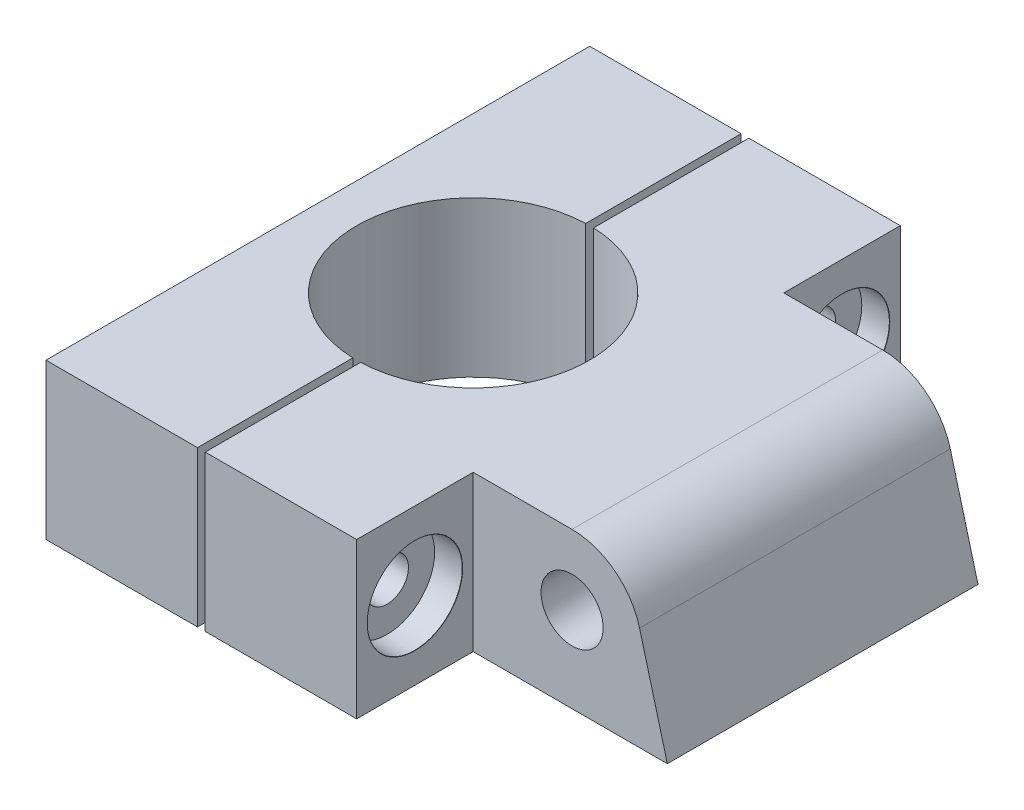
ISO-10303-21;
HEADER;
FILE_DESCRIPTION(('STEP AP214'),'2;1');
FILE_NAME('part.step','',(''),(''),'','','');
FILE_SCHEMA(('AUTOMOTIVE_DESIGN { 1 0 10303 214 1 1 1 1 }'));
ENDSEC;
DATA;
#1=APPLICATION_CONTEXT('core data for automotive mechanical design processes');
#2=APPLICATION_PROTOCOL_DEFINITION('international standard','automotive_design',2000,#1);
#3=PRODUCT_CONTEXT('',#1,'mechanical');
#4=PRODUCT('Part','Part','',(#3));
#5=PRODUCT_RELATED_PRODUCT_CATEGORY('part','',(#4));
#6=PRODUCT_DEFINITION_FORMATION('','',#4);
#7=PRODUCT_DEFINITION_CONTEXT('part definition',#1,'design');
#8=PRODUCT_DEFINITION('design','',#6,#7);
#9=PRODUCT_DEFINITION_SHAPE('','',#8);
#10=(LENGTH_UNIT() NAMED_UNIT(*) SI_UNIT(.MILLI.,.METRE.));
#11=(NAMED_UNIT(*) PLANE_ANGLE_UNIT() SI_UNIT($,.RADIAN.));
#12=(NAMED_UNIT(*) SI_UNIT($,.STERADIAN.) SOLID_ANGLE_UNIT());
#13=UNCERTAINTY_MEASURE_WITH_UNIT(LENGTH_MEASURE(1.E-05),#10,'distance_accuracy_value','');
#14=(GEOMETRIC_REPRESENTATION_CONTEXT(3) GLOBAL_UNCERTAINTY_ASSIGNED_CONTEXT((#13)) GLOBAL_UNIT_ASSIGNED_CONTEXT((#10,
#11,#12)) REPRESENTATION_CONTEXT('',''));
#15=CARTESIAN_POINT('',(0.,0.,0.));
#16=DIRECTION('',(0.,0.,1.));
#17=DIRECTION('',(1.,0.,0.));
#18=AXIS2_PLACEMENT_3D('',#15,#16,#17);
#19=CARTESIAN_POINT('',(0.,-10.,35.));
#20=DIRECTION('',(0.,1.,0.));
#21=DIRECTION('',(0.,0.,1.));
#22=AXIS2_PLACEMENT_3D('',#19,#20,#21);
#23=PLANE('',#22);
#24=DIRECTION('',(0.,0.,1.));
#25=VECTOR('',#24,1.);
#26=CARTESIAN_POINT('',(0.499999999999997,-10.,-35.));
#27=LINE('',#26,#25);
#28=CARTESIAN_POINT('',(0.499999999999997,-10.,-35.));
#29=VERTEX_POINT('',#28);
#30=CARTESIAN_POINT('',(0.5,-10.,-14.9916643505649));
#31=VERTEX_POINT('',#30);
#32=EDGE_CURVE('E278',#29,#31,#27,.T.);
#33=ORIENTED_EDGE('',*,*,#32,.F.);
#34=DIRECTION('',(1.,0.,0.));
#35=VECTOR('',#34,1.);
#36=CARTESIAN_POINT('',(0.,-10.,-35.));
#37=LINE('',#36,#35);
#38=CARTESIAN_POINT('',(20.,-10.,-35.));
#39=VERTEX_POINT('',#38);
#40=EDGE_CURVE('E241',#29,#39,#37,.T.);
#41=ORIENTED_EDGE('',*,*,#40,.T.);
#42=DIRECTION('',(0.,0.,-1.));
#43=VECTOR('',#42,1.);
#44=CARTESIAN_POINT('',(20.,-10.,35.));
#45=LINE('',#44,#43);
#46=CARTESIAN_POINT('',(20.,-10.,-20.));
#47=VERTEX_POINT('',#46);
#48=EDGE_CURVE('E239',#47,#39,#45,.T.);
#49=ORIENTED_EDGE('',*,*,#48,.F.);
#50=DIRECTION('',(1.,0.,0.));
#51=VECTOR('',#50,1.);
#52=CARTESIAN_POINT('',(0.,-10.,-20.));
#53=LINE('',#52,#51);
#54=CARTESIAN_POINT('',(45.,-10.,-20.));
#55=VERTEX_POINT('',#54);
#56=EDGE_CURVE('E200',#47,#55,#53,.T.);
#57=ORIENTED_EDGE('',*,*,#56,.T.);
#58=DIRECTION('',(0.,0.,-1.));
#59=VECTOR('',#58,1.);
#60=CARTESIAN_POINT('',(45.,-10.,20.));
#61=LINE('',#60,#59);
#62=CARTESIAN_POINT('',(45.,-10.,20.));
#63=VERTEX_POINT('',#62);
#64=EDGE_CURVE('E302',#63,#55,#61,.T.);
#65=ORIENTED_EDGE('',*,*,#64,.F.);
#66=DIRECTION('',(1.,0.,0.));
#67=VECTOR('',#66,1.);
#68=CARTESIAN_POINT('',(0.,-10.,20.));
#69=LINE('',#68,#67);
#70=CARTESIAN_POINT('',(20.,-10.,20.));
#71=VERTEX_POINT('',#70);
#72=EDGE_CURVE('E313',#71,#63,#69,.T.);
#73=ORIENTED_EDGE('',*,*,#72,.F.);
#74=CARTESIAN_POINT('',(20.,-10.,35.));
#75=VERTEX_POINT('',#74);
#76=EDGE_CURVE('E260',#75,#71,#45,.T.);
#77=ORIENTED_EDGE('',*,*,#76,.F.);
#78=DIRECTION('',(1.,0.,0.));
#79=VECTOR('',#78,1.);
#80=CARTESIAN_POINT('',(0.,-10.,35.));
#81=LINE('',#80,#79);
#82=CARTESIAN_POINT('',(0.500000000000006,-10.,35.));
#83=VERTEX_POINT('',#82);
#84=EDGE_CURVE('E211',#83,#75,#81,.T.);
#85=ORIENTED_EDGE('',*,*,#84,.F.);
#86=CARTESIAN_POINT('',(0.500000000000003,-10.,14.9916643505649));
#87=VERTEX_POINT('',#86);
#88=EDGE_CURVE('E99',#87,#83,#27,.T.);
#89=ORIENTED_EDGE('',*,*,#88,.F.);
#90=CARTESIAN_POINT('',(0.,-10.,0.));
#91=DIRECTION('',(0.,1.,0.));
#92=DIRECTION('',(0.,0.,1.));
#93=AXIS2_PLACEMENT_3D('',#90,#91,#92);
#94=CIRCLE('',#93,15.);
#95=EDGE_CURVE('E234',#87,#31,#94,.T.);
#96=ORIENTED_EDGE('',*,*,#95,.T.);
#97=EDGE_LOOP('',(#33,#41,#49,#57,#65,#73,#77,#85,#89,#96));
#98=FACE_BOUND('',#97,.T.);
#99=ADVANCED_FACE('F89',(#98),#23,.F.);
#100=CARTESIAN_POINT('',(0.,10.,35.));
#101=DIRECTION('',(0.,1.,0.));
#102=DIRECTION('',(0.,0.,1.));
#103=AXIS2_PLACEMENT_3D('',#100,#101,#102);
#104=PLANE('',#103);
#105=DIRECTION('',(1.,0.,0.));
#106=VECTOR('',#105,1.);
#107=CARTESIAN_POINT('',(0.,10.,-35.));
#108=LINE('',#107,#106);
#109=CARTESIAN_POINT('',(0.499999999999997,10.,-35.));
#110=VERTEX_POINT('',#109);
#111=CARTESIAN_POINT('',(20.,10.,-35.));
#112=VERTEX_POINT('',#111);
#113=EDGE_CURVE('E172',#110,#112,#108,.T.);
#114=ORIENTED_EDGE('',*,*,#113,.F.);
#115=DIRECTION('',(0.,0.,1.));
#116=VECTOR('',#115,1.);
#117=CARTESIAN_POINT('',(0.499999999999997,10.,-35.));
#118=LINE('',#117,#116);
#119=CARTESIAN_POINT('',(0.5,10.,-14.9916643505649));
#120=VERTEX_POINT('',#119);
#121=EDGE_CURVE('E231',#110,#120,#118,.T.);
#122=ORIENTED_EDGE('',*,*,#121,.T.);
#123=CARTESIAN_POINT('',(0.,10.,0.));
#124=DIRECTION('',(0.,1.,0.));
#125=DIRECTION('',(0.,0.,1.));
#126=AXIS2_PLACEMENT_3D('',#123,#124,#125);
#127=CIRCLE('',#126,15.);
#128=CARTESIAN_POINT('',(0.500000000000003,10.,14.9916643505649));
#129=VERTEX_POINT('',#128);
#130=EDGE_CURVE('E205',#129,#120,#127,.T.);
#131=ORIENTED_EDGE('',*,*,#130,.F.);
#132=CARTESIAN_POINT('',(0.500000000000006,10.,35.));
#133=VERTEX_POINT('',#132);
#134=EDGE_CURVE('E226',#129,#133,#118,.T.);
#135=ORIENTED_EDGE('',*,*,#134,.T.);
#136=DIRECTION('',(1.,0.,0.));
#137=VECTOR('',#136,1.);
#138=CARTESIAN_POINT('',(0.,10.,35.));
#139=LINE('',#138,#137);
#140=CARTESIAN_POINT('',(20.,10.,35.));
#141=VERTEX_POINT('',#140);
#142=EDGE_CURVE('E221',#133,#141,#139,.T.);
#143=ORIENTED_EDGE('',*,*,#142,.T.);
#144=DIRECTION('',(0.,0.,-1.));
#145=VECTOR('',#144,1.);
#146=CARTESIAN_POINT('',(20.,10.,35.));
#147=LINE('',#146,#145);
#148=CARTESIAN_POINT('',(20.,10.,20.));
#149=VERTEX_POINT('',#148);
#150=EDGE_CURVE('E213',#141,#149,#147,.T.);
#151=ORIENTED_EDGE('',*,*,#150,.T.);
#152=DIRECTION('',(-1.,0.,0.));
#153=VECTOR('',#152,1.);
#154=CARTESIAN_POINT('',(0.,10.,20.));
#155=LINE('',#154,#153);
#156=CARTESIAN_POINT('',(32.7350732595668,10.,20.));
#157=VERTEX_POINT('',#156);
#158=EDGE_CURVE('E315',#157,#149,#155,.T.);
#159=ORIENTED_EDGE('',*,*,#158,.F.);
#160=DIRECTION('',(0.,0.,-1.));
#161=VECTOR('',#160,1.);
#162=CARTESIAN_POINT('',(32.7350732595668,10.,20.));
#163=LINE('',#162,#161);
#164=CARTESIAN_POINT('',(32.7350732595668,10.,-20.));
#165=VERTEX_POINT('',#164);
#166=EDGE_CURVE('E194',#157,#165,#163,.T.);
#167=ORIENTED_EDGE('',*,*,#166,.T.);
#168=DIRECTION('',(-1.,0.,0.));
#169=VECTOR('',#168,1.);
#170=CARTESIAN_POINT('',(0.,10.,-20.));
#171=LINE('',#170,#169);
#172=CARTESIAN_POINT('',(20.,10.,-20.));
#173=VERTEX_POINT('',#172);
#174=EDGE_CURVE('E187',#165,#173,#171,.T.);
#175=ORIENTED_EDGE('',*,*,#174,.T.);
#176=EDGE_CURVE('E191',#173,#112,#147,.T.);
#177=ORIENTED_EDGE('',*,*,#176,.T.);
#178=EDGE_LOOP('',(#114,#122,#131,#135,#143,#151,#159,#167,#175,#177));
#179=FACE_BOUND('',#178,.T.);
#180=ADVANCED_FACE('F189',(#179),#104,.T.);
#181=CARTESIAN_POINT('',(0.,0.,35.));
#182=DIRECTION('',(0.,0.,1.));
#183=DIRECTION('',(1.,0.,0.));
#184=AXIS2_PLACEMENT_3D('',#181,#182,#183);
#185=PLANE('',#184);
#186=ORIENTED_EDGE('',*,*,#142,.F.);
#187=DIRECTION('',(0.,1.,0.));
#188=VECTOR('',#187,1.);
#189=CARTESIAN_POINT('',(0.500000000000006,-10.,35.));
#190=LINE('',#189,#188);
#191=EDGE_CURVE('E13',#83,#133,#190,.T.);
#192=ORIENTED_EDGE('',*,*,#191,.F.);
#193=ORIENTED_EDGE('',*,*,#84,.T.);
#194=DIRECTION('',(0.,1.,0.));
#195=VECTOR('',#194,1.);
#196=CARTESIAN_POINT('',(20.,0.,35.));
#197=LINE('',#196,#195);
#198=EDGE_CURVE('E215',#75,#141,#197,.T.);
#199=ORIENTED_EDGE('',*,*,#198,.T.);
#200=EDGE_LOOP('',(#186,#192,#193,#199));
#201=FACE_BOUND('',#200,.T.);
#202=ADVANCED_FACE('F360',(#201),#185,.T.);
#203=CARTESIAN_POINT('',(0.,0.,-35.));
#204=DIRECTION('',(0.,0.,1.));
#205=DIRECTION('',(1.,0.,0.));
#206=AXIS2_PLACEMENT_3D('',#203,#204,#205);
#207=PLANE('',#206);
#208=DIRECTION('',(0.,1.,0.));
#209=VECTOR('',#208,1.);
#210=CARTESIAN_POINT('',(0.499999999999997,-10.,-35.));
#211=LINE('',#210,#209);
#212=EDGE_CURVE('E240',#29,#110,#211,.T.);
#213=ORIENTED_EDGE('',*,*,#212,.T.);
#214=ORIENTED_EDGE('',*,*,#113,.T.);
#215=DIRECTION('',(0.,1.,0.));
#216=VECTOR('',#215,1.);
#217=CARTESIAN_POINT('',(20.,0.,-35.));
#218=LINE('',#217,#216);
#219=EDGE_CURVE('E209',#39,#112,#218,.T.);
#220=ORIENTED_EDGE('',*,*,#219,.F.);
#221=ORIENTED_EDGE('',*,*,#40,.F.);
#222=EDGE_LOOP('',(#213,#214,#220,#221));
#223=FACE_BOUND('',#222,.T.);
#224=ADVANCED_FACE('F275',(#223),#207,.F.);
#225=CARTESIAN_POINT('',(20.,0.,35.));
#226=DIRECTION('',(-1.,0.,0.));
#227=DIRECTION('',(0.,0.,1.));
#228=AXIS2_PLACEMENT_3D('',#225,#226,#227);
#229=PLANE('',#228);
#230=CARTESIAN_POINT('',(20.,0.,-27.5));
#231=DIRECTION('',(1.,0.,0.));
#232=DIRECTION('',(0.,0.,-1.));
#233=AXIS2_PLACEMENT_3D('',#230,#231,#232);
#234=CIRCLE('',#233,6.145);
#235=CARTESIAN_POINT('',(20.,0.,-33.645));
#236=VERTEX_POINT('',#235);
#237=EDGE_CURVE('E571',#236,#236,#234,.T.);
#238=ORIENTED_EDGE('',*,*,#237,.F.);
#239=EDGE_LOOP('',(#238));
#240=FACE_BOUND('',#239,.T.);
#241=DIRECTION('',(0.,1.,0.));
#242=VECTOR('',#241,1.);
#243=CARTESIAN_POINT('',(20.,0.,-20.));
#244=LINE('',#243,#242);
#245=EDGE_CURVE('E198',#47,#173,#244,.T.);
#246=ORIENTED_EDGE('',*,*,#245,.F.);
#247=ORIENTED_EDGE('',*,*,#48,.T.);
#248=ORIENTED_EDGE('',*,*,#219,.T.);
#249=ORIENTED_EDGE('',*,*,#176,.F.);
#250=EDGE_LOOP('',(#246,#247,#248,#249));
#251=FACE_BOUND('',#250,.T.);
#252=ADVANCED_FACE('F208',(#240,#251),#229,.F.);
#253=CARTESIAN_POINT('',(20.,0.,27.5));
#254=DIRECTION('',(1.,0.,0.));
#255=DIRECTION('',(0.,0.,-1.));
#256=AXIS2_PLACEMENT_3D('',#253,#254,#255);
#257=CIRCLE('',#256,6.145);
#258=CARTESIAN_POINT('',(20.,0.,21.355));
#259=VERTEX_POINT('',#258);
#260=EDGE_CURVE('E557',#259,#259,#257,.T.);
#261=ORIENTED_EDGE('',*,*,#260,.F.);
#262=EDGE_LOOP('',(#261));
#263=FACE_BOUND('',#262,.T.);
#264=ORIENTED_EDGE('',*,*,#76,.T.);
#265=DIRECTION('',(0.,1.,0.));
#266=VECTOR('',#265,1.);
#267=CARTESIAN_POINT('',(20.,0.,20.));
#268=LINE('',#267,#266);
#269=EDGE_CURVE('E263',#71,#149,#268,.T.);
#270=ORIENTED_EDGE('',*,*,#269,.T.);
#271=ORIENTED_EDGE('',*,*,#150,.F.);
#272=ORIENTED_EDGE('',*,*,#198,.F.);
#273=EDGE_LOOP('',(#264,#270,#271,#272));
#274=FACE_BOUND('',#273,.T.);
#275=ADVANCED_FACE('F343',(#263,#274),#229,.F.);
#276=CARTESIAN_POINT('',(39.4855715851498,10.5801270189223,20.));
#277=DIRECTION('',(-0.965925826289068,-0.258819045102524,0.));
#278=DIRECTION('',(0.258819045102524,-0.965925826289068,0.));
#279=AXIS2_PLACEMENT_3D('',#276,#277,#278);
#280=PLANE('',#279);
#281=DIRECTION('',(-0.258819045102524,0.965925826289068,0.));
#282=VECTOR('',#281,1.);
#283=CARTESIAN_POINT('',(39.4855715851498,10.5801270189223,-20.));
#284=LINE('',#283,#282);
#285=CARTESIAN_POINT('',(41.4284056961685,3.32937140592276,-20.));
#286=VERTEX_POINT('',#285);
#287=EDGE_CURVE('E270',#55,#286,#284,.T.);
#288=ORIENTED_EDGE('',*,*,#287,.T.);
#289=DIRECTION('',(0.,0.,-1.));
#290=VECTOR('',#289,1.);
#291=CARTESIAN_POINT('',(41.4284056961685,3.32937140592276,20.));
#292=LINE('',#291,#290);
#293=CARTESIAN_POINT('',(41.4284056961685,3.32937140592276,20.));
#294=VERTEX_POINT('',#293);
#295=EDGE_CURVE('E306',#294,#286,#292,.T.);
#296=ORIENTED_EDGE('',*,*,#295,.F.);
#297=DIRECTION('',(-0.258819045102524,0.965925826289068,0.));
#298=VECTOR('',#297,1.);
#299=CARTESIAN_POINT('',(39.4855715851498,10.5801270189223,20.));
#300=LINE('',#299,#298);
#301=EDGE_CURVE('E321',#63,#294,#300,.T.);
#302=ORIENTED_EDGE('',*,*,#301,.F.);
#303=ORIENTED_EDGE('',*,*,#64,.T.);
#304=EDGE_LOOP('',(#288,#296,#302,#303));
#305=FACE_BOUND('',#304,.T.);
#306=ADVANCED_FACE('F338',(#305),#280,.F.);
#307=CARTESIAN_POINT('',(32.7350732595668,1.,20.));
#308=DIRECTION('',(0.,0.,-1.));
#309=DIRECTION('',(-1.,0.,0.));
#310=AXIS2_PLACEMENT_3D('',#307,#308,#309);
#311=CYLINDRICAL_SURFACE('',#310,9.00000000000003);
#312=CARTESIAN_POINT('',(32.7350732595668,1.,-20.));
#313=DIRECTION('',(0.,0.,1.));
#314=DIRECTION('',(1.,0.,0.));
#315=AXIS2_PLACEMENT_3D('',#312,#313,#314);
#316=CIRCLE('',#315,9.00000000000003);
#317=EDGE_CURVE('E137',#286,#165,#316,.T.);
#318=ORIENTED_EDGE('',*,*,#317,.T.);
#319=ORIENTED_EDGE('',*,*,#166,.F.);
#320=CARTESIAN_POINT('',(32.7350732595668,1.,20.));
#321=DIRECTION('',(0.,0.,1.));
#322=DIRECTION('',(1.,0.,0.));
#323=AXIS2_PLACEMENT_3D('',#320,#321,#322);
#324=CIRCLE('',#323,9.00000000000003);
#325=EDGE_CURVE('E159',#294,#157,#324,.T.);
#326=ORIENTED_EDGE('',*,*,#325,.F.);
#327=ORIENTED_EDGE('',*,*,#295,.T.);
#328=EDGE_LOOP('',(#318,#319,#326,#327));
#329=FACE_BOUND('',#328,.T.);
#330=ADVANCED_FACE('F335',(#329),#311,.T.);
#331=CARTESIAN_POINT('',(32.7350732595668,1.,20.));
#332=DIRECTION('',(0.,0.,-1.));
#333=DIRECTION('',(-1.,0.,0.));
#334=AXIS2_PLACEMENT_3D('',#331,#332,#333);
#335=CYLINDRICAL_SURFACE('',#334,4.00000000000001);
#336=CARTESIAN_POINT('',(32.7350732595668,1.,20.));
#337=DIRECTION('',(0.,0.,1.));
#338=DIRECTION('',(1.,0.,0.));
#339=AXIS2_PLACEMENT_3D('',#336,#337,#338);
#340=CIRCLE('',#339,4.00000000000001);
#341=CARTESIAN_POINT('',(36.7350732595668,1.,20.));
#342=VERTEX_POINT('',#341);
#343=EDGE_CURVE('E324',#342,#342,#340,.T.);
#344=ORIENTED_EDGE('',*,*,#343,.T.);
#345=EDGE_LOOP('',(#344));
#346=FACE_BOUND('',#345,.T.);
#347=CARTESIAN_POINT('',(32.7350732595668,1.,-20.));
#348=DIRECTION('',(0.,0.,1.));
#349=DIRECTION('',(1.,0.,0.));
#350=AXIS2_PLACEMENT_3D('',#347,#348,#349);
#351=CIRCLE('',#350,4.00000000000001);
#352=CARTESIAN_POINT('',(36.7350732595668,1.,-20.));
#353=VERTEX_POINT('',#352);
#354=EDGE_CURVE('E206',#353,#353,#351,.T.);
#355=ORIENTED_EDGE('',*,*,#354,.F.);
#356=EDGE_LOOP('',(#355));
#357=FACE_BOUND('',#356,.T.);
#358=ADVANCED_FACE('F378',(#346,#357),#335,.F.);
#359=CARTESIAN_POINT('',(0.,0.,20.));
#360=DIRECTION('',(0.,0.,1.));
#361=DIRECTION('',(1.,0.,0.));
#362=AXIS2_PLACEMENT_3D('',#359,#360,#361);
#363=PLANE('',#362);
#364=ORIENTED_EDGE('',*,*,#343,.F.);
#365=EDGE_LOOP('',(#364));
#366=FACE_BOUND('',#365,.T.);
#367=ORIENTED_EDGE('',*,*,#301,.T.);
#368=ORIENTED_EDGE('',*,*,#325,.T.);
#369=ORIENTED_EDGE('',*,*,#158,.T.);
#370=ORIENTED_EDGE('',*,*,#269,.F.);
#371=ORIENTED_EDGE('',*,*,#72,.T.);
#372=EDGE_LOOP('',(#367,#368,#369,#370,#371));
#373=FACE_BOUND('',#372,.T.);
#374=ADVANCED_FACE('F342',(#366,#373),#363,.T.);
#375=CARTESIAN_POINT('',(0.,0.,-20.));
#376=DIRECTION('',(0.,0.,1.));
#377=DIRECTION('',(1.,0.,0.));
#378=AXIS2_PLACEMENT_3D('',#375,#376,#377);
#379=PLANE('',#378);
#380=ORIENTED_EDGE('',*,*,#354,.T.);
#381=EDGE_LOOP('',(#380));
#382=FACE_BOUND('',#381,.T.);
#383=ORIENTED_EDGE('',*,*,#287,.F.);
#384=ORIENTED_EDGE('',*,*,#56,.F.);
#385=ORIENTED_EDGE('',*,*,#245,.T.);
#386=ORIENTED_EDGE('',*,*,#174,.F.);
#387=ORIENTED_EDGE('',*,*,#317,.F.);
#388=EDGE_LOOP('',(#383,#384,#385,#386,#387));
#389=FACE_BOUND('',#388,.T.);
#390=ADVANCED_FACE('F199',(#382,#389),#379,.F.);
#391=CARTESIAN_POINT('',(0.,-10.,0.));
#392=DIRECTION('',(0.,1.,0.));
#393=DIRECTION('',(0.,0.,1.));
#394=AXIS2_PLACEMENT_3D('',#391,#392,#393);
#395=CYLINDRICAL_SURFACE('',#394,15.);
#396=ORIENTED_EDGE('',*,*,#130,.T.);
#397=DIRECTION('',(0.,1.,0.));
#398=VECTOR('',#397,1.);
#399=CARTESIAN_POINT('',(0.5,-10.,-14.9916643505649));
#400=LINE('',#399,#398);
#401=EDGE_CURVE('E128',#31,#120,#400,.T.);
#402=ORIENTED_EDGE('',*,*,#401,.F.);
#403=ORIENTED_EDGE('',*,*,#95,.F.);
#404=DIRECTION('',(0.,1.,0.));
#405=VECTOR('',#404,1.);
#406=CARTESIAN_POINT('',(0.500000000000003,-10.,14.9916643505649));
#407=LINE('',#406,#405);
#408=EDGE_CURVE('E285',#87,#129,#407,.T.);
#409=ORIENTED_EDGE('',*,*,#408,.T.);
#410=EDGE_LOOP('',(#396,#402,#403,#409));
#411=FACE_BOUND('',#410,.T.);
#412=ADVANCED_FACE('F292',(#411),#395,.F.);
#413=CARTESIAN_POINT('',(0.499999999999997,-10.,-35.));
#414=DIRECTION('',(-1.,0.,0.));
#415=DIRECTION('',(0.,0.,1.));
#416=AXIS2_PLACEMENT_3D('',#413,#414,#415);
#417=PLANE('',#416);
#418=CARTESIAN_POINT('',(0.499999999999997,0.,-27.5));
#419=DIRECTION('',(-1.,0.,0.));
#420=DIRECTION('',(0.,0.,1.));
#421=AXIS2_PLACEMENT_3D('',#418,#419,#420);
#422=CIRCLE('',#421,2.75);
#423=CARTESIAN_POINT('',(0.499999999999997,0.,-24.75));
#424=VERTEX_POINT('',#423);
#425=EDGE_CURVE('E243',#424,#424,#422,.T.);
#426=ORIENTED_EDGE('',*,*,#425,.F.);
#427=EDGE_LOOP('',(#426));
#428=FACE_BOUND('',#427,.T.);
#429=ORIENTED_EDGE('',*,*,#401,.T.);
#430=ORIENTED_EDGE('',*,*,#121,.F.);
#431=ORIENTED_EDGE('',*,*,#212,.F.);
#432=ORIENTED_EDGE('',*,*,#32,.T.);
#433=EDGE_LOOP('',(#429,#430,#431,#432));
#434=FACE_BOUND('',#433,.T.);
#435=ADVANCED_FACE('F370',(#428,#434),#417,.T.);
#436=CARTESIAN_POINT('',(0.500000000000004,0.,27.5));
#437=DIRECTION('',(-1.,0.,0.));
#438=DIRECTION('',(0.,0.,1.));
#439=AXIS2_PLACEMENT_3D('',#436,#437,#438);
#440=CIRCLE('',#439,2.75);
#441=CARTESIAN_POINT('',(0.500000000000004,0.,30.25));
#442=VERTEX_POINT('',#441);
#443=EDGE_CURVE('E92',#442,#442,#440,.T.);
#444=ORIENTED_EDGE('',*,*,#443,.F.);
#445=EDGE_LOOP('',(#444));
#446=FACE_BOUND('',#445,.T.);
#447=ORIENTED_EDGE('',*,*,#408,.F.);
#448=ORIENTED_EDGE('',*,*,#88,.T.);
#449=ORIENTED_EDGE('',*,*,#191,.T.);
#450=ORIENTED_EDGE('',*,*,#134,.F.);
#451=EDGE_LOOP('',(#447,#448,#449,#450));
#452=FACE_BOUND('',#451,.T.);
#453=ADVANCED_FACE('F371',(#446,#452),#417,.T.);
#454=CARTESIAN_POINT('',(20.,0.,-27.5));
#455=DIRECTION('',(1.,0.,0.));
#456=DIRECTION('',(0.,0.,-1.));
#457=AXIS2_PLACEMENT_3D('',#454,#455,#456);
#458=CYLINDRICAL_SURFACE('',#457,2.75);
#459=ORIENTED_EDGE('',*,*,#425,.T.);
#460=EDGE_LOOP('',(#459));
#461=FACE_BOUND('',#460,.T.);
#462=CARTESIAN_POINT('',(16.42,0.,-27.5));
#463=DIRECTION('',(1.,0.,0.));
#464=DIRECTION('',(0.,0.,-1.));
#465=AXIS2_PLACEMENT_3D('',#462,#463,#464);
#466=CIRCLE('',#465,2.75);
#467=CARTESIAN_POINT('',(16.42,0.,-30.25));
#468=VERTEX_POINT('',#467);
#469=EDGE_CURVE('E246',#468,#468,#466,.T.);
#470=ORIENTED_EDGE('',*,*,#469,.T.);
#471=EDGE_LOOP('',(#470));
#472=FACE_BOUND('',#471,.T.);
#473=ADVANCED_FACE('F375',(#461,#472),#458,.F.);
#474=CARTESIAN_POINT('',(16.42,6.12000000000001,-27.5));
#475=DIRECTION('',(-1.,0.,0.));
#476=DIRECTION('',(0.,0.,1.));
#477=AXIS2_PLACEMENT_3D('',#474,#475,#476);
#478=PLANE('',#477);
#479=ORIENTED_EDGE('',*,*,#469,.F.);
#480=EDGE_LOOP('',(#479));
#481=FACE_BOUND('',#480,.T.);
#482=CARTESIAN_POINT('',(16.42,0.,-27.5));
#483=DIRECTION('',(1.,0.,0.));
#484=DIRECTION('',(0.,0.,-1.));
#485=AXIS2_PLACEMENT_3D('',#482,#483,#484);
#486=CIRCLE('',#485,6.12);
#487=CARTESIAN_POINT('',(16.42,0.,-33.62));
#488=VERTEX_POINT('',#487);
#489=EDGE_CURVE('E251',#488,#488,#486,.T.);
#490=ORIENTED_EDGE('',*,*,#489,.T.);
#491=EDGE_LOOP('',(#490));
#492=FACE_BOUND('',#491,.T.);
#493=ADVANCED_FACE('F422',(#481,#492),#478,.F.);
#494=CARTESIAN_POINT('',(20.,0.,-27.5));
#495=DIRECTION('',(1.,0.,0.));
#496=DIRECTION('',(0.,0.,-1.));
#497=AXIS2_PLACEMENT_3D('',#494,#495,#496);
#498=CYLINDRICAL_SURFACE('',#497,6.12);
#499=ORIENTED_EDGE('',*,*,#489,.F.);
#500=EDGE_LOOP('',(#499));
#501=FACE_BOUND('',#500,.T.);
#502=CARTESIAN_POINT('',(19.975,0.,-27.5));
#503=DIRECTION('',(1.,0.,0.));
#504=DIRECTION('',(0.,0.,-1.));
#505=AXIS2_PLACEMENT_3D('',#502,#503,#504);
#506=CIRCLE('',#505,6.12);
#507=CARTESIAN_POINT('',(19.975,0.,-33.62));
#508=VERTEX_POINT('',#507);
#509=EDGE_CURVE('E257',#508,#508,#506,.T.);
#510=ORIENTED_EDGE('',*,*,#509,.T.);
#511=EDGE_LOOP('',(#510));
#512=FACE_BOUND('',#511,.T.);
#513=ADVANCED_FACE('F428',(#501,#512),#498,.F.);
#514=CARTESIAN_POINT('',(20.,0.,-27.5));
#515=DIRECTION('',(1.,0.,0.));
#516=DIRECTION('',(0.,0.,-1.));
#517=AXIS2_PLACEMENT_3D('',#514,#515,#516);
#518=CONICAL_SURFACE('',#517,6.145,0.785398163397448);
#519=ORIENTED_EDGE('',*,*,#509,.F.);
#520=EDGE_LOOP('',(#519));
#521=FACE_BOUND('',#520,.T.);
#522=ORIENTED_EDGE('',*,*,#237,.T.);
#523=EDGE_LOOP('',(#522));
#524=FACE_BOUND('',#523,.T.);
#525=ADVANCED_FACE('F436',(#521,#524),#518,.F.);
#526=CARTESIAN_POINT('',(20.,0.,27.5));
#527=DIRECTION('',(1.,0.,0.));
#528=DIRECTION('',(0.,0.,-1.));
#529=AXIS2_PLACEMENT_3D('',#526,#527,#528);
#530=CYLINDRICAL_SURFACE('',#529,2.75);
#531=ORIENTED_EDGE('',*,*,#443,.T.);
#532=EDGE_LOOP('',(#531));
#533=FACE_BOUND('',#532,.T.);
#534=CARTESIAN_POINT('',(16.42,0.,27.5));
#535=DIRECTION('',(1.,0.,0.));
#536=DIRECTION('',(0.,0.,-1.));
#537=AXIS2_PLACEMENT_3D('',#534,#535,#536);
#538=CIRCLE('',#537,2.75);
#539=CARTESIAN_POINT('',(16.42,0.,24.75));
#540=VERTEX_POINT('',#539);
#541=EDGE_CURVE('E567',#540,#540,#538,.T.);
#542=ORIENTED_EDGE('',*,*,#541,.T.);
#543=EDGE_LOOP('',(#542));
#544=FACE_BOUND('',#543,.T.);
#545=ADVANCED_FACE('F444',(#533,#544),#530,.F.);
#546=CARTESIAN_POINT('',(16.42,6.12,27.5));
#547=DIRECTION('',(-1.,0.,0.));
#548=DIRECTION('',(0.,0.,1.));
#549=AXIS2_PLACEMENT_3D('',#546,#547,#548);
#550=PLANE('',#549);
#551=ORIENTED_EDGE('',*,*,#541,.F.);
#552=EDGE_LOOP('',(#551));
#553=FACE_BOUND('',#552,.T.);
#554=CARTESIAN_POINT('',(16.42,0.,27.5));
#555=DIRECTION('',(1.,0.,0.));
#556=DIRECTION('',(0.,0.,-1.));
#557=AXIS2_PLACEMENT_3D('',#554,#555,#556);
#558=CIRCLE('',#557,6.12);
#559=CARTESIAN_POINT('',(16.42,0.,21.38));
#560=VERTEX_POINT('',#559);
#561=EDGE_CURVE('E561',#560,#560,#558,.T.);
#562=ORIENTED_EDGE('',*,*,#561,.T.);
#563=EDGE_LOOP('',(#562));
#564=FACE_BOUND('',#563,.T.);
#565=ADVANCED_FACE('F452',(#553,#564),#550,.F.);
#566=CARTESIAN_POINT('',(20.,0.,27.5));
#567=DIRECTION('',(1.,0.,0.));
#568=DIRECTION('',(0.,0.,-1.));
#569=AXIS2_PLACEMENT_3D('',#566,#567,#568);
#570=CYLINDRICAL_SURFACE('',#569,6.12);
#571=ORIENTED_EDGE('',*,*,#561,.F.);
#572=EDGE_LOOP('',(#571));
#573=FACE_BOUND('',#572,.T.);
#574=CARTESIAN_POINT('',(19.975,0.,27.5));
#575=DIRECTION('',(1.,0.,0.));
#576=DIRECTION('',(0.,0.,-1.));
#577=AXIS2_PLACEMENT_3D('',#574,#575,#576);
#578=CIRCLE('',#577,6.12);
#579=CARTESIAN_POINT('',(19.975,0.,21.38));
#580=VERTEX_POINT('',#579);
#581=EDGE_CURVE('E555',#580,#580,#578,.T.);
#582=ORIENTED_EDGE('',*,*,#581,.T.);
#583=EDGE_LOOP('',(#582));
#584=FACE_BOUND('',#583,.T.);
#585=ADVANCED_FACE('F460',(#573,#584),#570,.F.);
#586=CARTESIAN_POINT('',(20.,0.,27.5));
#587=DIRECTION('',(1.,0.,0.));
#588=DIRECTION('',(0.,0.,-1.));
#589=AXIS2_PLACEMENT_3D('',#586,#587,#588);
#590=CONICAL_SURFACE('',#589,6.145,0.785398163397448);
#591=ORIENTED_EDGE('',*,*,#581,.F.);
#592=EDGE_LOOP('',(#591));
#593=FACE_BOUND('',#592,.T.);
#594=ORIENTED_EDGE('',*,*,#260,.T.);
#595=EDGE_LOOP('',(#594));
#596=FACE_BOUND('',#595,.T.);
#597=ADVANCED_FACE('F468',(#593,#596),#590,.F.);
#598=CLOSED_SHELL('',(#99,#180,#202,#224,#252,#275,#306,#330,#358,#374,#390,#412,#435,#453,#473,
#493,#513,#525,#545,#565,#585,#597));
#599=MANIFOLD_SOLID_BREP('B2',#598);
#600=CARTESIAN_POINT('',(-20.,0.,35.));
#601=DIRECTION('',(-1.,0.,0.));
#602=DIRECTION('',(0.,0.,1.));
#603=AXIS2_PLACEMENT_3D('',#600,#601,#602);
#604=PLANE('',#603);
#605=CARTESIAN_POINT('',(-20.,0.,27.5));
#606=DIRECTION('',(1.,0.,0.));
#607=DIRECTION('',(0.,0.,-1.));
#608=AXIS2_PLACEMENT_3D('',#605,#606,#607);
#609=CIRCLE('',#608,2.74999999999999);
#610=CARTESIAN_POINT('',(-20.,0.,24.75));
#611=VERTEX_POINT('',#610);
#612=EDGE_CURVE('E682',#611,#611,#609,.T.);
#613=ORIENTED_EDGE('',*,*,#612,.T.);
#614=EDGE_LOOP('',(#613));
#615=FACE_BOUND('',#614,.T.);
#616=DIRECTION('',(0.,1.,0.));
#617=VECTOR('',#616,1.);
#618=CARTESIAN_POINT('',(-20.,0.,-35.));
#619=LINE('',#618,#617);
#620=CARTESIAN_POINT('',(-20.,-10.,-35.));
#621=VERTEX_POINT('',#620);
#622=CARTESIAN_POINT('',(-20.,10.,-35.));
#623=VERTEX_POINT('',#622);
#624=EDGE_CURVE('E641',#621,#623,#619,.T.);
#625=ORIENTED_EDGE('',*,*,#624,.F.);
#626=DIRECTION('',(0.,0.,-1.));
#627=VECTOR('',#626,1.);
#628=CARTESIAN_POINT('',(-20.,-10.,35.));
#629=LINE('',#628,#627);
#630=CARTESIAN_POINT('',(-20.,-10.,35.));
#631=VERTEX_POINT('',#630);
#632=EDGE_CURVE('E602',#631,#621,#629,.T.);
#633=ORIENTED_EDGE('',*,*,#632,.F.);
#634=DIRECTION('',(0.,1.,0.));
#635=VECTOR('',#634,1.);
#636=CARTESIAN_POINT('',(-20.,0.,35.));
#637=LINE('',#636,#635);
#638=CARTESIAN_POINT('',(-20.,10.,35.));
#639=VERTEX_POINT('',#638);
#640=EDGE_CURVE('E635',#631,#639,#637,.T.);
#641=ORIENTED_EDGE('',*,*,#640,.T.);
#642=DIRECTION('',(0.,0.,-1.));
#643=VECTOR('',#642,1.);
#644=CARTESIAN_POINT('',(-20.,10.,35.));
#645=LINE('',#644,#643);
#646=EDGE_CURVE('E87',#639,#623,#645,.T.);
#647=ORIENTED_EDGE('',*,*,#646,.T.);
#648=EDGE_LOOP('',(#625,#633,#641,#647));
#649=FACE_BOUND('',#648,.T.);
#650=CARTESIAN_POINT('',(-20.,0.,-27.5));
#651=DIRECTION('',(1.,0.,0.));
#652=DIRECTION('',(0.,0.,-1.));
#653=AXIS2_PLACEMENT_3D('',#650,#651,#652);
#654=CIRCLE('',#653,2.74999999999999);
#655=CARTESIAN_POINT('',(-20.,0.,-30.25));
#656=VERTEX_POINT('',#655);
#657=EDGE_CURVE('E676',#656,#656,#654,.T.);
#658=ORIENTED_EDGE('',*,*,#657,.T.);
#659=EDGE_LOOP('',(#658));
#660=FACE_BOUND('',#659,.T.);
#661=ADVANCED_FACE('F593',(#615,#649,#660),#604,.T.);
#662=CARTESIAN_POINT('',(0.,0.,35.));
#663=DIRECTION('',(0.,0.,1.));
#664=DIRECTION('',(1.,0.,0.));
#665=AXIS2_PLACEMENT_3D('',#662,#663,#664);
#666=PLANE('',#665);
#667=DIRECTION('',(0.,1.,0.));
#668=VECTOR('',#667,1.);
#669=CARTESIAN_POINT('',(-0.499999999999995,-10.,35.));
#670=LINE('',#669,#668);
#671=CARTESIAN_POINT('',(-0.499999999999995,-10.,35.));
#672=VERTEX_POINT('',#671);
#673=CARTESIAN_POINT('',(-0.499999999999995,10.,35.));
#674=VERTEX_POINT('',#673);
#675=EDGE_CURVE('E656',#672,#674,#670,.T.);
#676=ORIENTED_EDGE('',*,*,#675,.T.);
#677=DIRECTION('',(1.,0.,0.));
#678=VECTOR('',#677,1.);
#679=CARTESIAN_POINT('',(0.,10.,35.));
#680=LINE('',#679,#678);
#681=EDGE_CURVE('E649',#639,#674,#680,.T.);
#682=ORIENTED_EDGE('',*,*,#681,.F.);
#683=ORIENTED_EDGE('',*,*,#640,.F.);
#684=DIRECTION('',(1.,0.,0.));
#685=VECTOR('',#684,1.);
#686=CARTESIAN_POINT('',(0.,-10.,35.));
#687=LINE('',#686,#685);
#688=EDGE_CURVE('E633',#631,#672,#687,.T.);
#689=ORIENTED_EDGE('',*,*,#688,.T.);
#690=EDGE_LOOP('',(#676,#682,#683,#689));
#691=FACE_BOUND('',#690,.T.);
#692=ADVANCED_FACE('F713',(#691),#666,.T.);
#693=CARTESIAN_POINT('',(0.,0.,-35.));
#694=DIRECTION('',(0.,0.,1.));
#695=DIRECTION('',(1.,0.,0.));
#696=AXIS2_PLACEMENT_3D('',#693,#694,#695);
#697=PLANE('',#696);
#698=DIRECTION('',(1.,0.,0.));
#699=VECTOR('',#698,1.);
#700=CARTESIAN_POINT('',(0.,10.,-35.));
#701=LINE('',#700,#699);
#702=CARTESIAN_POINT('',(-0.500000000000004,10.,-35.));
#703=VERTEX_POINT('',#702);
#704=EDGE_CURVE('E643',#623,#703,#701,.T.);
#705=ORIENTED_EDGE('',*,*,#704,.T.);
#706=DIRECTION('',(0.,1.,0.));
#707=VECTOR('',#706,1.);
#708=CARTESIAN_POINT('',(-0.500000000000004,-10.,-35.));
#709=LINE('',#708,#707);
#710=CARTESIAN_POINT('',(-0.500000000000004,-10.,-35.));
#711=VERTEX_POINT('',#710);
#712=EDGE_CURVE('E642',#711,#703,#709,.T.);
#713=ORIENTED_EDGE('',*,*,#712,.F.);
#714=DIRECTION('',(1.,0.,0.));
#715=VECTOR('',#714,1.);
#716=CARTESIAN_POINT('',(0.,-10.,-35.));
#717=LINE('',#716,#715);
#718=EDGE_CURVE('E630',#621,#711,#717,.T.);
#719=ORIENTED_EDGE('',*,*,#718,.F.);
#720=ORIENTED_EDGE('',*,*,#624,.T.);
#721=EDGE_LOOP('',(#705,#713,#719,#720));
#722=FACE_BOUND('',#721,.T.);
#723=ADVANCED_FACE('F640',(#722),#697,.F.);
#724=CARTESIAN_POINT('',(0.,10.,35.));
#725=DIRECTION('',(0.,1.,0.));
#726=DIRECTION('',(0.,0.,1.));
#727=AXIS2_PLACEMENT_3D('',#724,#725,#726);
#728=PLANE('',#727);
#729=DIRECTION('',(0.,0.,1.));
#730=VECTOR('',#729,1.);
#731=CARTESIAN_POINT('',(-0.500000000000004,10.,-35.));
#732=LINE('',#731,#730);
#733=CARTESIAN_POINT('',(-0.499999999999998,10.,14.9916643505649));
#734=VERTEX_POINT('',#733);
#735=EDGE_CURVE('E665',#734,#674,#732,.T.);
#736=ORIENTED_EDGE('',*,*,#735,.F.);
#737=CARTESIAN_POINT('',(0.,10.,0.));
#738=DIRECTION('',(0.,1.,0.));
#739=DIRECTION('',(0.,0.,1.));
#740=AXIS2_PLACEMENT_3D('',#737,#738,#739);
#741=CIRCLE('',#740,15.);
#742=CARTESIAN_POINT('',(-0.500000000000001,10.,-14.9916643505649));
#743=VERTEX_POINT('',#742);
#744=EDGE_CURVE('E659',#743,#734,#741,.T.);
#745=ORIENTED_EDGE('',*,*,#744,.F.);
#746=EDGE_CURVE('E661',#703,#743,#732,.T.);
#747=ORIENTED_EDGE('',*,*,#746,.F.);
#748=ORIENTED_EDGE('',*,*,#704,.F.);
#749=ORIENTED_EDGE('',*,*,#646,.F.);
#750=ORIENTED_EDGE('',*,*,#681,.T.);
#751=EDGE_LOOP('',(#736,#745,#747,#748,#749,#750));
#752=FACE_BOUND('',#751,.T.);
#753=ADVANCED_FACE('F714',(#752),#728,.T.);
#754=CARTESIAN_POINT('',(0.,-10.,35.));
#755=DIRECTION('',(0.,1.,0.));
#756=DIRECTION('',(0.,0.,1.));
#757=AXIS2_PLACEMENT_3D('',#754,#755,#756);
#758=PLANE('',#757);
#759=CARTESIAN_POINT('',(0.,-10.,0.));
#760=DIRECTION('',(0.,1.,0.));
#761=DIRECTION('',(0.,0.,1.));
#762=AXIS2_PLACEMENT_3D('',#759,#760,#761);
#763=CIRCLE('',#762,15.);
#764=CARTESIAN_POINT('',(-0.500000000000001,-10.,-14.9916643505649));
#765=VERTEX_POINT('',#764);
#766=CARTESIAN_POINT('',(-0.499999999999998,-10.,14.9916643505649));
#767=VERTEX_POINT('',#766);
#768=EDGE_CURVE('E670',#765,#767,#763,.T.);
#769=ORIENTED_EDGE('',*,*,#768,.T.);
#770=DIRECTION('',(0.,0.,1.));
#771=VECTOR('',#770,1.);
#772=CARTESIAN_POINT('',(-0.500000000000004,-10.,-35.));
#773=LINE('',#772,#771);
#774=EDGE_CURVE('E664',#767,#672,#773,.T.);
#775=ORIENTED_EDGE('',*,*,#774,.T.);
#776=ORIENTED_EDGE('',*,*,#688,.F.);
#777=ORIENTED_EDGE('',*,*,#632,.T.);
#778=ORIENTED_EDGE('',*,*,#718,.T.);
#779=EDGE_CURVE('E609',#711,#765,#773,.T.);
#780=ORIENTED_EDGE('',*,*,#779,.T.);
#781=EDGE_LOOP('',(#769,#775,#776,#777,#778,#780));
#782=FACE_BOUND('',#781,.T.);
#783=ADVANCED_FACE('F595',(#782),#758,.F.);
#784=CARTESIAN_POINT('',(-0.500000000000004,-10.,-35.));
#785=DIRECTION('',(-1.,0.,0.));
#786=DIRECTION('',(0.,0.,1.));
#787=AXIS2_PLACEMENT_3D('',#784,#785,#786);
#788=PLANE('',#787);
#789=CARTESIAN_POINT('',(-0.499999999999997,0.,27.5));
#790=DIRECTION('',(-1.,0.,0.));
#791=DIRECTION('',(0.,0.,1.));
#792=AXIS2_PLACEMENT_3D('',#789,#790,#791);
#793=CIRCLE('',#792,2.75);
#794=CARTESIAN_POINT('',(-0.499999999999997,0.,30.25));
#795=VERTEX_POINT('',#794);
#796=EDGE_CURVE('E679',#795,#795,#793,.T.);
#797=ORIENTED_EDGE('',*,*,#796,.T.);
#798=EDGE_LOOP('',(#797));
#799=FACE_BOUND('',#798,.T.);
#800=ORIENTED_EDGE('',*,*,#735,.T.);
#801=ORIENTED_EDGE('',*,*,#675,.F.);
#802=ORIENTED_EDGE('',*,*,#774,.F.);
#803=DIRECTION('',(0.,1.,0.));
#804=VECTOR('',#803,1.);
#805=CARTESIAN_POINT('',(-0.499999999999998,-10.,14.9916643505649));
#806=LINE('',#805,#804);
#807=EDGE_CURVE('E644',#767,#734,#806,.T.);
#808=ORIENTED_EDGE('',*,*,#807,.T.);
#809=EDGE_LOOP('',(#800,#801,#802,#808));
#810=FACE_BOUND('',#809,.T.);
#811=ADVANCED_FACE('F694',(#799,#810),#788,.F.);
#812=CARTESIAN_POINT('',(-0.500000000000004,0.,-27.5));
#813=DIRECTION('',(-1.,0.,0.));
#814=DIRECTION('',(0.,0.,1.));
#815=AXIS2_PLACEMENT_3D('',#812,#813,#814);
#816=CIRCLE('',#815,2.75);
#817=CARTESIAN_POINT('',(-0.500000000000004,0.,-24.75));
#818=VERTEX_POINT('',#817);
#819=EDGE_CURVE('E597',#818,#818,#816,.T.);
#820=ORIENTED_EDGE('',*,*,#819,.T.);
#821=EDGE_LOOP('',(#820));
#822=FACE_BOUND('',#821,.T.);
#823=ORIENTED_EDGE('',*,*,#779,.F.);
#824=ORIENTED_EDGE('',*,*,#712,.T.);
#825=ORIENTED_EDGE('',*,*,#746,.T.);
#826=DIRECTION('',(0.,1.,0.));
#827=VECTOR('',#826,1.);
#828=CARTESIAN_POINT('',(-0.500000000000001,-10.,-14.9916643505649));
#829=LINE('',#828,#827);
#830=EDGE_CURVE('E667',#765,#743,#829,.T.);
#831=ORIENTED_EDGE('',*,*,#830,.F.);
#832=EDGE_LOOP('',(#823,#824,#825,#831));
#833=FACE_BOUND('',#832,.T.);
#834=ADVANCED_FACE('F697',(#822,#833),#788,.F.);
#835=CARTESIAN_POINT('',(0.,-10.,0.));
#836=DIRECTION('',(0.,1.,0.));
#837=DIRECTION('',(0.,0.,1.));
#838=AXIS2_PLACEMENT_3D('',#835,#836,#837);
#839=CYLINDRICAL_SURFACE('',#838,15.);
#840=ORIENTED_EDGE('',*,*,#744,.T.);
#841=ORIENTED_EDGE('',*,*,#807,.F.);
#842=ORIENTED_EDGE('',*,*,#768,.F.);
#843=ORIENTED_EDGE('',*,*,#830,.T.);
#844=EDGE_LOOP('',(#840,#841,#842,#843));
#845=FACE_BOUND('',#844,.T.);
#846=ADVANCED_FACE('F725',(#845),#839,.F.);
#847=CARTESIAN_POINT('',(20.,0.,-27.5));
#848=DIRECTION('',(1.,0.,0.));
#849=DIRECTION('',(0.,0.,-1.));
#850=AXIS2_PLACEMENT_3D('',#847,#848,#849);
#851=CYLINDRICAL_SURFACE('',#850,2.75);
#852=ORIENTED_EDGE('',*,*,#657,.F.);
#853=EDGE_LOOP('',(#852));
#854=FACE_BOUND('',#853,.T.);
#855=ORIENTED_EDGE('',*,*,#819,.F.);
#856=EDGE_LOOP('',(#855));
#857=FACE_BOUND('',#856,.T.);
#858=ADVANCED_FACE('F690',(#854,#857),#851,.F.);
#859=CARTESIAN_POINT('',(20.,0.,27.5));
#860=DIRECTION('',(1.,0.,0.));
#861=DIRECTION('',(0.,0.,-1.));
#862=AXIS2_PLACEMENT_3D('',#859,#860,#861);
#863=CYLINDRICAL_SURFACE('',#862,2.75);
#864=ORIENTED_EDGE('',*,*,#612,.F.);
#865=EDGE_LOOP('',(#864));
#866=FACE_BOUND('',#865,.T.);
#867=ORIENTED_EDGE('',*,*,#796,.F.);
#868=EDGE_LOOP('',(#867));
#869=FACE_BOUND('',#868,.T.);
#870=ADVANCED_FACE('F687',(#866,#869),#863,.F.);
#871=CLOSED_SHELL('',(#661,#692,#723,#753,#783,#811,#834,#846,#858,#870));
#872=MANIFOLD_SOLID_BREP('B7',#871);
#873=ADVANCED_BREP_SHAPE_REPRESENTATION('',(#18,#599,#872),#14);
#874=SHAPE_DEFINITION_REPRESENTATION(#9,#873);
ENDSEC;
END-ISO-10303-21;
